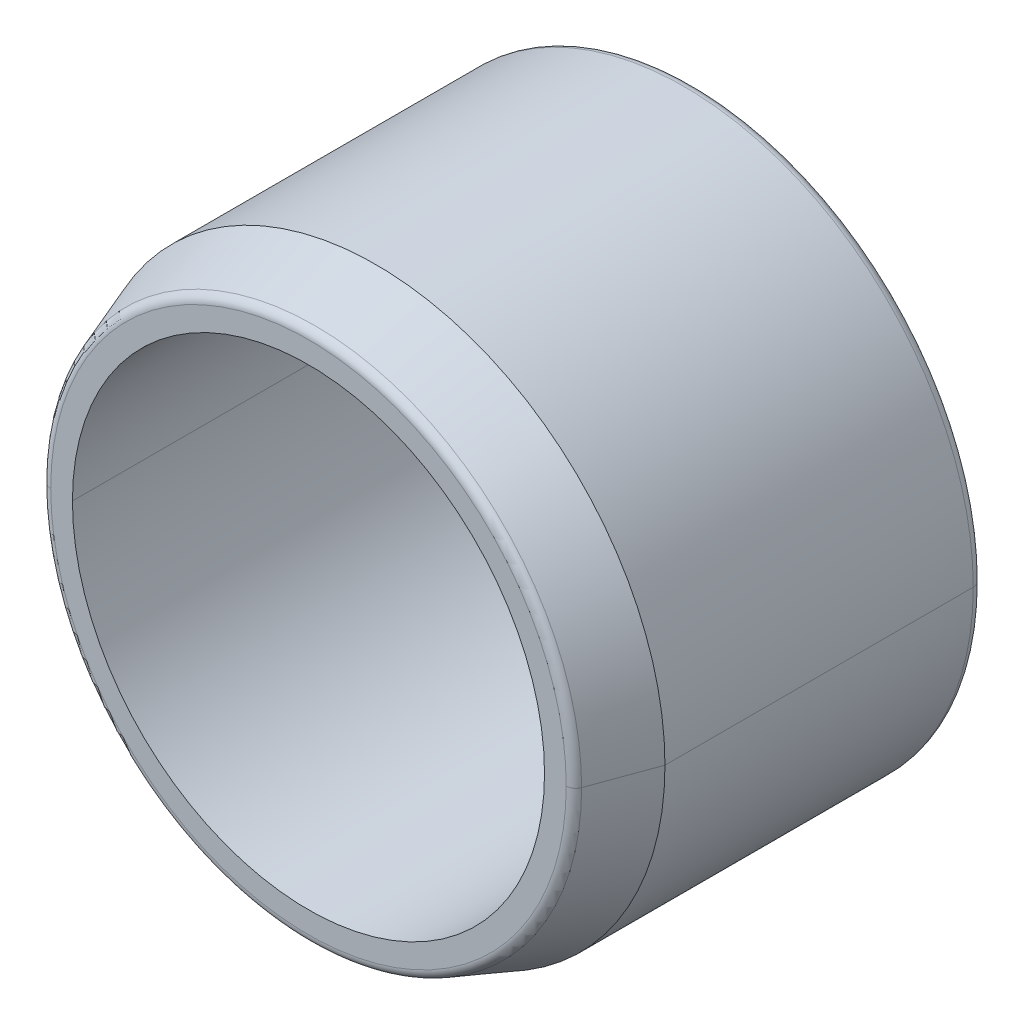
ISO-10303-21;
HEADER;
FILE_DESCRIPTION(('STEP AP214'),'2;1');
FILE_NAME('part.step','',(''),(''),'','','');
FILE_SCHEMA(('AUTOMOTIVE_DESIGN { 1 0 10303 214 1 1 1 1 }'));
ENDSEC;
DATA;
#1=APPLICATION_CONTEXT('core data for automotive mechanical design processes');
#2=APPLICATION_PROTOCOL_DEFINITION('international standard','automotive_design',2000,#1);
#3=PRODUCT_CONTEXT('',#1,'mechanical');
#4=PRODUCT('Part','Part','',(#3));
#5=PRODUCT_RELATED_PRODUCT_CATEGORY('part','',(#4));
#6=PRODUCT_DEFINITION_FORMATION('','',#4);
#7=PRODUCT_DEFINITION_CONTEXT('part definition',#1,'design');
#8=PRODUCT_DEFINITION('design','',#6,#7);
#9=PRODUCT_DEFINITION_SHAPE('','',#8);
#10=(LENGTH_UNIT() NAMED_UNIT(*) SI_UNIT(.MILLI.,.METRE.));
#11=(NAMED_UNIT(*) PLANE_ANGLE_UNIT() SI_UNIT($,.RADIAN.));
#12=(NAMED_UNIT(*) SI_UNIT($,.STERADIAN.) SOLID_ANGLE_UNIT());
#13=UNCERTAINTY_MEASURE_WITH_UNIT(LENGTH_MEASURE(1.E-05),#10,'distance_accuracy_value','');
#14=(GEOMETRIC_REPRESENTATION_CONTEXT(3) GLOBAL_UNCERTAINTY_ASSIGNED_CONTEXT((#13)) GLOBAL_UNIT_ASSIGNED_CONTEXT((#10,
#11,#12)) REPRESENTATION_CONTEXT('',''));
#15=CARTESIAN_POINT('',(0.,0.,0.));
#16=DIRECTION('',(0.,0.,1.));
#17=DIRECTION('',(1.,0.,0.));
#18=AXIS2_PLACEMENT_3D('',#15,#16,#17);
#19=CARTESIAN_POINT('',(0.,0.,39.));
#20=DIRECTION('',(0.,0.,1.));
#21=DIRECTION('',(1.,0.,0.));
#22=AXIS2_PLACEMENT_3D('',#19,#20,#21);
#23=TOROIDAL_SURFACE('',#22,26.7520008219268,1.);
#24=CARTESIAN_POINT('',(-26.7520008219268,0.,39.));
#25=DIRECTION('',(0.,1.,0.));
#26=DIRECTION('',(-1.,0.,0.));
#27=AXIS2_PLACEMENT_3D('',#24,#25,#26);
#28=CIRCLE('',#27,1.);
#29=CARTESIAN_POINT('',(-27.6916934427128,0.,39.3420201433256));
#30=VERTEX_POINT('',#29);
#31=CARTESIAN_POINT('',(-26.7520008219268,0.,40.));
#32=VERTEX_POINT('',#31);
#33=EDGE_CURVE('E148',#30,#32,#28,.T.);
#34=ORIENTED_EDGE('',*,*,#33,.F.);
#35=CARTESIAN_POINT('',(0.,0.,39.3420201433256));
#36=DIRECTION('',(0.,0.,-1.));
#37=DIRECTION('',(1.,0.,0.));
#38=AXIS2_PLACEMENT_3D('',#35,#36,#37);
#39=CIRCLE('',#38,27.6916934427128);
#40=CARTESIAN_POINT('',(27.6916934427128,0.,39.3420201433256));
#41=VERTEX_POINT('',#40);
#42=EDGE_CURVE('E10',#41,#30,#39,.T.);
#43=ORIENTED_EDGE('',*,*,#42,.F.);
#44=CARTESIAN_POINT('',(26.7520008219268,0.,39.));
#45=DIRECTION('',(0.,-1.,0.));
#46=DIRECTION('',(0.,0.,-1.));
#47=AXIS2_PLACEMENT_3D('',#44,#45,#46);
#48=CIRCLE('',#47,1.);
#49=CARTESIAN_POINT('',(26.7520008219268,0.,40.));
#50=VERTEX_POINT('',#49);
#51=EDGE_CURVE('E159',#41,#50,#48,.T.);
#52=ORIENTED_EDGE('',*,*,#51,.T.);
#53=CARTESIAN_POINT('',(0.,0.,40.));
#54=DIRECTION('',(0.,0.,1.));
#55=DIRECTION('',(1.,0.,0.));
#56=AXIS2_PLACEMENT_3D('',#53,#54,#55);
#57=CIRCLE('',#56,26.7520008219268);
#58=EDGE_CURVE('E108',#32,#50,#57,.T.);
#59=ORIENTED_EDGE('',*,*,#58,.F.);
#60=EDGE_LOOP('',(#34,#43,#52,#59));
#61=FACE_BOUND('',#60,.T.);
#62=ADVANCED_FACE('F15',(#61),#23,.T.);
#63=CARTESIAN_POINT('',(0.,0.,1.));
#64=DIRECTION('',(0.,0.,1.));
#65=DIRECTION('',(1.,0.,0.));
#66=AXIS2_PLACEMENT_3D('',#63,#64,#65);
#67=TOROIDAL_SURFACE('',#66,29.,1.);
#68=CARTESIAN_POINT('',(-29.,0.,1.));
#69=DIRECTION('',(0.,1.,0.));
#70=DIRECTION('',(-1.,0.,0.));
#71=AXIS2_PLACEMENT_3D('',#68,#69,#70);
#72=CIRCLE('',#71,1.);
#73=CARTESIAN_POINT('',(-29.,0.,0.));
#74=VERTEX_POINT('',#73);
#75=CARTESIAN_POINT('',(-30.,0.,1.));
#76=VERTEX_POINT('',#75);
#77=EDGE_CURVE('E178',#74,#76,#72,.T.);
#78=ORIENTED_EDGE('',*,*,#77,.F.);
#79=CARTESIAN_POINT('',(0.,0.,0.));
#80=DIRECTION('',(0.,0.,-1.));
#81=DIRECTION('',(1.,0.,0.));
#82=AXIS2_PLACEMENT_3D('',#79,#80,#81);
#83=CIRCLE('',#82,29.);
#84=CARTESIAN_POINT('',(29.,0.,0.));
#85=VERTEX_POINT('',#84);
#86=EDGE_CURVE('E125',#85,#74,#83,.T.);
#87=ORIENTED_EDGE('',*,*,#86,.F.);
#88=CARTESIAN_POINT('',(29.,0.,1.));
#89=DIRECTION('',(0.,-1.,0.));
#90=DIRECTION('',(0.,0.,-1.));
#91=AXIS2_PLACEMENT_3D('',#88,#89,#90);
#92=CIRCLE('',#91,1.);
#93=CARTESIAN_POINT('',(30.,0.,1.));
#94=VERTEX_POINT('',#93);
#95=EDGE_CURVE('E194',#85,#94,#92,.T.);
#96=ORIENTED_EDGE('',*,*,#95,.T.);
#97=CARTESIAN_POINT('',(0.,0.,1.));
#98=DIRECTION('',(0.,0.,1.));
#99=DIRECTION('',(1.,0.,0.));
#100=AXIS2_PLACEMENT_3D('',#97,#98,#99);
#101=CIRCLE('',#100,30.);
#102=EDGE_CURVE('E26',#76,#94,#101,.T.);
#103=ORIENTED_EDGE('',*,*,#102,.F.);
#104=EDGE_LOOP('',(#78,#87,#96,#103));
#105=FACE_BOUND('',#104,.T.);
#106=ADVANCED_FACE('F343',(#105),#67,.T.);
#107=CARTESIAN_POINT('',(0.,0.,40.));
#108=DIRECTION('',(0.,0.,-1.));
#109=DIRECTION('',(-1.,0.,0.));
#110=AXIS2_PLACEMENT_3D('',#107,#108,#109);
#111=CONICAL_SURFACE('',#110,27.4522083601366,0.349065850398863);
#112=DIRECTION('',(0.342020143325666,0.,-0.939692620785909));
#113=VECTOR('',#112,1.);
#114=CARTESIAN_POINT('',(27.4522083601366,0.,40.));
#115=LINE('',#114,#113);
#116=CARTESIAN_POINT('',(30.,0.,33.));
#117=VERTEX_POINT('',#116);
#118=EDGE_CURVE('E168',#41,#117,#115,.T.);
#119=ORIENTED_EDGE('',*,*,#118,.F.);
#120=ORIENTED_EDGE('',*,*,#42,.T.);
#121=DIRECTION('',(-0.342020143325666,0.,-0.939692620785909));
#122=VECTOR('',#121,1.);
#123=CARTESIAN_POINT('',(-27.4522083601366,0.,40.));
#124=LINE('',#123,#122);
#125=CARTESIAN_POINT('',(-30.,0.,33.));
#126=VERTEX_POINT('',#125);
#127=EDGE_CURVE('E138',#30,#126,#124,.T.);
#128=ORIENTED_EDGE('',*,*,#127,.T.);
#129=CARTESIAN_POINT('',(0.,0.,33.));
#130=DIRECTION('',(0.,0.,-1.));
#131=DIRECTION('',(1.,0.,0.));
#132=AXIS2_PLACEMENT_3D('',#129,#130,#131);
#133=CIRCLE('',#132,30.);
#134=EDGE_CURVE('E66',#117,#126,#133,.T.);
#135=ORIENTED_EDGE('',*,*,#134,.F.);
#136=EDGE_LOOP('',(#119,#120,#128,#135));
#137=FACE_BOUND('',#136,.T.);
#138=ADVANCED_FACE('F335',(#137),#111,.T.);
#139=CARTESIAN_POINT('',(0.,0.,40.));
#140=DIRECTION('',(0.,0.,-1.));
#141=DIRECTION('',(-1.,0.,0.));
#142=AXIS2_PLACEMENT_3D('',#139,#140,#141);
#143=CYLINDRICAL_SURFACE('',#142,24.5);
#144=DIRECTION('',(0.,0.,-1.));
#145=VECTOR('',#144,1.);
#146=CARTESIAN_POINT('',(24.5,0.,40.));
#147=LINE('',#146,#145);
#148=CARTESIAN_POINT('',(24.5,0.,40.));
#149=VERTEX_POINT('',#148);
#150=CARTESIAN_POINT('',(24.5,0.,0.));
#151=VERTEX_POINT('',#150);
#152=EDGE_CURVE('E128',#149,#151,#147,.T.);
#153=ORIENTED_EDGE('',*,*,#152,.F.);
#154=CARTESIAN_POINT('',(0.,0.,40.));
#155=DIRECTION('',(0.,0.,1.));
#156=DIRECTION('',(1.,0.,0.));
#157=AXIS2_PLACEMENT_3D('',#154,#155,#156);
#158=CIRCLE('',#157,24.5);
#159=CARTESIAN_POINT('',(-24.5,0.,40.));
#160=VERTEX_POINT('',#159);
#161=EDGE_CURVE('E116',#149,#160,#158,.T.);
#162=ORIENTED_EDGE('',*,*,#161,.T.);
#163=DIRECTION('',(0.,0.,-1.));
#164=VECTOR('',#163,1.);
#165=CARTESIAN_POINT('',(-24.5,0.,40.));
#166=LINE('',#165,#164);
#167=CARTESIAN_POINT('',(-24.5,0.,0.));
#168=VERTEX_POINT('',#167);
#169=EDGE_CURVE('E136',#160,#168,#166,.T.);
#170=ORIENTED_EDGE('',*,*,#169,.T.);
#171=CARTESIAN_POINT('',(0.,0.,0.));
#172=DIRECTION('',(0.,0.,1.));
#173=DIRECTION('',(1.,0.,0.));
#174=AXIS2_PLACEMENT_3D('',#171,#172,#173);
#175=CIRCLE('',#174,24.5);
#176=EDGE_CURVE('E39',#151,#168,#175,.T.);
#177=ORIENTED_EDGE('',*,*,#176,.F.);
#178=EDGE_LOOP('',(#153,#162,#170,#177));
#179=FACE_BOUND('',#178,.T.);
#180=ADVANCED_FACE('F129',(#179),#143,.F.);
#181=CARTESIAN_POINT('',(0.,0.,40.));
#182=DIRECTION('',(0.,0.,-1.));
#183=DIRECTION('',(-1.,0.,0.));
#184=AXIS2_PLACEMENT_3D('',#181,#182,#183);
#185=CYLINDRICAL_SURFACE('',#184,30.);
#186=DIRECTION('',(0.,0.,-1.));
#187=VECTOR('',#186,1.);
#188=CARTESIAN_POINT('',(30.,0.,40.));
#189=LINE('',#188,#187);
#190=EDGE_CURVE('E190',#117,#94,#189,.T.);
#191=ORIENTED_EDGE('',*,*,#190,.F.);
#192=ORIENTED_EDGE('',*,*,#134,.T.);
#193=DIRECTION('',(0.,0.,-1.));
#194=VECTOR('',#193,1.);
#195=CARTESIAN_POINT('',(-30.,0.,40.));
#196=LINE('',#195,#194);
#197=EDGE_CURVE('E182',#126,#76,#196,.T.);
#198=ORIENTED_EDGE('',*,*,#197,.T.);
#199=ORIENTED_EDGE('',*,*,#102,.T.);
#200=EDGE_LOOP('',(#191,#192,#198,#199));
#201=FACE_BOUND('',#200,.T.);
#202=ADVANCED_FACE('F296',(#201),#185,.T.);
#203=CARTESIAN_POINT('',(0.,0.,0.));
#204=DIRECTION('',(0.,0.,1.));
#205=DIRECTION('',(1.,0.,0.));
#206=AXIS2_PLACEMENT_3D('',#203,#204,#205);
#207=PLANE('',#206);
#208=CARTESIAN_POINT('',(0.,0.,0.));
#209=DIRECTION('',(0.,0.,1.));
#210=DIRECTION('',(1.,0.,0.));
#211=AXIS2_PLACEMENT_3D('',#208,#209,#210);
#212=CIRCLE('',#211,24.5);
#213=EDGE_CURVE('E133',#168,#151,#212,.T.);
#214=ORIENTED_EDGE('',*,*,#213,.T.);
#215=ORIENTED_EDGE('',*,*,#176,.T.);
#216=EDGE_LOOP('',(#214,#215));
#217=FACE_BOUND('',#216,.T.);
#218=ORIENTED_EDGE('',*,*,#86,.T.);
#219=CARTESIAN_POINT('',(0.,0.,0.));
#220=DIRECTION('',(0.,0.,-1.));
#221=DIRECTION('',(1.,0.,0.));
#222=AXIS2_PLACEMENT_3D('',#219,#220,#221);
#223=CIRCLE('',#222,29.);
#224=EDGE_CURVE('E172',#74,#85,#223,.T.);
#225=ORIENTED_EDGE('',*,*,#224,.T.);
#226=EDGE_LOOP('',(#218,#225));
#227=FACE_BOUND('',#226,.T.);
#228=ADVANCED_FACE('F301',(#217,#227),#207,.F.);
#229=CARTESIAN_POINT('',(0.,0.,40.));
#230=DIRECTION('',(0.,0.,1.));
#231=DIRECTION('',(1.,0.,0.));
#232=AXIS2_PLACEMENT_3D('',#229,#230,#231);
#233=PLANE('',#232);
#234=CARTESIAN_POINT('',(0.,0.,40.));
#235=DIRECTION('',(0.,0.,1.));
#236=DIRECTION('',(1.,0.,0.));
#237=AXIS2_PLACEMENT_3D('',#234,#235,#236);
#238=CIRCLE('',#237,24.5);
#239=EDGE_CURVE('E121',#160,#149,#238,.T.);
#240=ORIENTED_EDGE('',*,*,#239,.F.);
#241=ORIENTED_EDGE('',*,*,#161,.F.);
#242=EDGE_LOOP('',(#240,#241));
#243=FACE_BOUND('',#242,.T.);
#244=CARTESIAN_POINT('',(0.,0.,40.));
#245=DIRECTION('',(0.,0.,1.));
#246=DIRECTION('',(1.,0.,0.));
#247=AXIS2_PLACEMENT_3D('',#244,#245,#246);
#248=CIRCLE('',#247,26.7520008219268);
#249=EDGE_CURVE('E151',#50,#32,#248,.T.);
#250=ORIENTED_EDGE('',*,*,#249,.T.);
#251=ORIENTED_EDGE('',*,*,#58,.T.);
#252=EDGE_LOOP('',(#250,#251));
#253=FACE_BOUND('',#252,.T.);
#254=ADVANCED_FACE('F118',(#243,#253),#233,.T.);
#255=CARTESIAN_POINT('',(0.,0.,40.));
#256=DIRECTION('',(0.,0.,-1.));
#257=DIRECTION('',(-1.,0.,0.));
#258=AXIS2_PLACEMENT_3D('',#255,#256,#257);
#259=CYLINDRICAL_SURFACE('',#258,30.);
#260=CARTESIAN_POINT('',(0.,0.,33.));
#261=DIRECTION('',(0.,0.,-1.));
#262=DIRECTION('',(1.,0.,0.));
#263=AXIS2_PLACEMENT_3D('',#260,#261,#262);
#264=CIRCLE('',#263,30.);
#265=EDGE_CURVE('E144',#126,#117,#264,.T.);
#266=ORIENTED_EDGE('',*,*,#265,.T.);
#267=ORIENTED_EDGE('',*,*,#190,.T.);
#268=CARTESIAN_POINT('',(0.,0.,1.));
#269=DIRECTION('',(0.,0.,1.));
#270=DIRECTION('',(1.,0.,0.));
#271=AXIS2_PLACEMENT_3D('',#268,#269,#270);
#272=CIRCLE('',#271,30.);
#273=EDGE_CURVE('E187',#94,#76,#272,.T.);
#274=ORIENTED_EDGE('',*,*,#273,.T.);
#275=ORIENTED_EDGE('',*,*,#197,.F.);
#276=EDGE_LOOP('',(#266,#267,#274,#275));
#277=FACE_BOUND('',#276,.T.);
#278=ADVANCED_FACE('F17',(#277),#259,.T.);
#279=CARTESIAN_POINT('',(0.,0.,40.));
#280=DIRECTION('',(0.,0.,-1.));
#281=DIRECTION('',(-1.,0.,0.));
#282=AXIS2_PLACEMENT_3D('',#279,#280,#281);
#283=CYLINDRICAL_SURFACE('',#282,24.5);
#284=ORIENTED_EDGE('',*,*,#239,.T.);
#285=ORIENTED_EDGE('',*,*,#152,.T.);
#286=ORIENTED_EDGE('',*,*,#213,.F.);
#287=ORIENTED_EDGE('',*,*,#169,.F.);
#288=EDGE_LOOP('',(#284,#285,#286,#287));
#289=FACE_BOUND('',#288,.T.);
#290=ADVANCED_FACE('F135',(#289),#283,.F.);
#291=CARTESIAN_POINT('',(0.,0.,40.));
#292=DIRECTION('',(0.,0.,-1.));
#293=DIRECTION('',(-1.,0.,0.));
#294=AXIS2_PLACEMENT_3D('',#291,#292,#293);
#295=CONICAL_SURFACE('',#294,27.4522083601366,0.349065850398863);
#296=CARTESIAN_POINT('',(0.,0.,39.3420201433256));
#297=DIRECTION('',(0.,0.,-1.));
#298=DIRECTION('',(1.,0.,0.));
#299=AXIS2_PLACEMENT_3D('',#296,#297,#298);
#300=CIRCLE('',#299,27.6916934427128);
#301=EDGE_CURVE('E19',#30,#41,#300,.T.);
#302=ORIENTED_EDGE('',*,*,#301,.T.);
#303=ORIENTED_EDGE('',*,*,#118,.T.);
#304=ORIENTED_EDGE('',*,*,#265,.F.);
#305=ORIENTED_EDGE('',*,*,#127,.F.);
#306=EDGE_LOOP('',(#302,#303,#304,#305));
#307=FACE_BOUND('',#306,.T.);
#308=ADVANCED_FACE('F166',(#307),#295,.T.);
#309=CARTESIAN_POINT('',(0.,0.,1.));
#310=DIRECTION('',(0.,0.,1.));
#311=DIRECTION('',(1.,0.,0.));
#312=AXIS2_PLACEMENT_3D('',#309,#310,#311);
#313=TOROIDAL_SURFACE('',#312,29.,1.);
#314=ORIENTED_EDGE('',*,*,#224,.F.);
#315=ORIENTED_EDGE('',*,*,#77,.T.);
#316=ORIENTED_EDGE('',*,*,#273,.F.);
#317=ORIENTED_EDGE('',*,*,#95,.F.);
#318=EDGE_LOOP('',(#314,#315,#316,#317));
#319=FACE_BOUND('',#318,.T.);
#320=ADVANCED_FACE('F310',(#319),#313,.T.);
#321=CARTESIAN_POINT('',(0.,0.,39.));
#322=DIRECTION('',(0.,0.,1.));
#323=DIRECTION('',(1.,0.,0.));
#324=AXIS2_PLACEMENT_3D('',#321,#322,#323);
#325=TOROIDAL_SURFACE('',#324,26.7520008219268,1.);
#326=ORIENTED_EDGE('',*,*,#301,.F.);
#327=ORIENTED_EDGE('',*,*,#33,.T.);
#328=ORIENTED_EDGE('',*,*,#249,.F.);
#329=ORIENTED_EDGE('',*,*,#51,.F.);
#330=EDGE_LOOP('',(#326,#327,#328,#329));
#331=FACE_BOUND('',#330,.T.);
#332=ADVANCED_FACE('F170',(#331),#325,.T.);
#333=CLOSED_SHELL('',(#62,#106,#138,#180,#202,#228,#254,#278,#290,#308,#320,#332));
#334=MANIFOLD_SOLID_BREP('B1',#333);
#335=ADVANCED_BREP_SHAPE_REPRESENTATION('',(#18,#334),#14);
#336=SHAPE_DEFINITION_REPRESENTATION(#9,#335);
ENDSEC;
END-ISO-10303-21;
